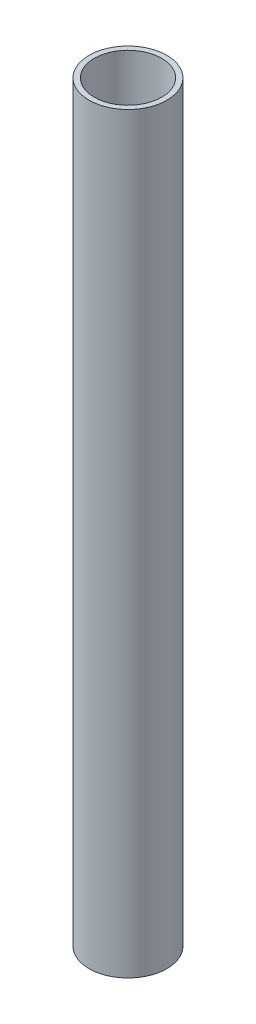
ISO-10303-21;
HEADER;
FILE_DESCRIPTION(('STEP AP214'),'2;1');
FILE_NAME('part.step','',(''),(''),'','','');
FILE_SCHEMA(('AUTOMOTIVE_DESIGN { 1 0 10303 214 1 1 1 1 }'));
ENDSEC;
DATA;
#1=APPLICATION_CONTEXT('core data for automotive mechanical design processes');
#2=APPLICATION_PROTOCOL_DEFINITION('international standard','automotive_design',2000,#1);
#3=PRODUCT_CONTEXT('',#1,'mechanical');
#4=PRODUCT('Part','Part','',(#3));
#5=PRODUCT_RELATED_PRODUCT_CATEGORY('part','',(#4));
#6=PRODUCT_DEFINITION_FORMATION('','',#4);
#7=PRODUCT_DEFINITION_CONTEXT('part definition',#1,'design');
#8=PRODUCT_DEFINITION('design','',#6,#7);
#9=PRODUCT_DEFINITION_SHAPE('','',#8);
#10=(LENGTH_UNIT() NAMED_UNIT(*) SI_UNIT(.MILLI.,.METRE.));
#11=(NAMED_UNIT(*) PLANE_ANGLE_UNIT() SI_UNIT($,.RADIAN.));
#12=(NAMED_UNIT(*) SI_UNIT($,.STERADIAN.) SOLID_ANGLE_UNIT());
#13=UNCERTAINTY_MEASURE_WITH_UNIT(LENGTH_MEASURE(1.E-05),#10,'distance_accuracy_value','');
#14=(GEOMETRIC_REPRESENTATION_CONTEXT(3) GLOBAL_UNCERTAINTY_ASSIGNED_CONTEXT((#13)) GLOBAL_UNIT_ASSIGNED_CONTEXT((#10,
#11,#12)) REPRESENTATION_CONTEXT('',''));
#15=CARTESIAN_POINT('',(0.,0.,0.));
#16=DIRECTION('',(0.,0.,1.));
#17=DIRECTION('',(1.,0.,0.));
#18=AXIS2_PLACEMENT_3D('',#15,#16,#17);
#19=CARTESIAN_POINT('',(0.,145.,0.));
#20=DIRECTION('',(0.,1.,0.));
#21=DIRECTION('',(0.,0.,1.));
#22=AXIS2_PLACEMENT_3D('',#19,#20,#21);
#23=PLANE('',#22);
#24=CARTESIAN_POINT('',(0.,145.,0.));
#25=DIRECTION('',(0.,1.,0.));
#26=DIRECTION('',(0.,0.,1.));
#27=AXIS2_PLACEMENT_3D('',#24,#25,#26);
#28=CIRCLE('',#27,7.5);
#29=CARTESIAN_POINT('',(0.,145.,7.5));
#30=VERTEX_POINT('',#29);
#31=EDGE_CURVE('E10',#30,#30,#28,.T.);
#32=ORIENTED_EDGE('',*,*,#31,.T.);
#33=EDGE_LOOP('',(#32));
#34=FACE_BOUND('',#33,.T.);
#35=CARTESIAN_POINT('',(0.,145.,0.));
#36=DIRECTION('',(0.,1.,0.));
#37=DIRECTION('',(0.,0.,1.));
#38=AXIS2_PLACEMENT_3D('',#35,#36,#37);
#39=CIRCLE('',#38,6.5);
#40=CARTESIAN_POINT('',(0.,145.,6.5));
#41=VERTEX_POINT('',#40);
#42=EDGE_CURVE('E45',#41,#41,#39,.T.);
#43=ORIENTED_EDGE('',*,*,#42,.F.);
#44=EDGE_LOOP('',(#43));
#45=FACE_BOUND('',#44,.T.);
#46=ADVANCED_FACE('F34',(#34,#45),#23,.T.);
#47=CARTESIAN_POINT('',(0.,0.,0.));
#48=DIRECTION('',(0.,1.,0.));
#49=DIRECTION('',(0.,0.,1.));
#50=AXIS2_PLACEMENT_3D('',#47,#48,#49);
#51=PLANE('',#50);
#52=CARTESIAN_POINT('',(0.,0.,0.));
#53=DIRECTION('',(0.,1.,0.));
#54=DIRECTION('',(0.,0.,1.));
#55=AXIS2_PLACEMENT_3D('',#52,#53,#54);
#56=CIRCLE('',#55,7.5);
#57=CARTESIAN_POINT('',(0.,0.,7.5));
#58=VERTEX_POINT('',#57);
#59=EDGE_CURVE('E38',#58,#58,#56,.T.);
#60=ORIENTED_EDGE('',*,*,#59,.F.);
#61=EDGE_LOOP('',(#60));
#62=FACE_BOUND('',#61,.T.);
#63=CARTESIAN_POINT('',(0.,0.,0.));
#64=DIRECTION('',(0.,1.,0.));
#65=DIRECTION('',(0.,0.,1.));
#66=AXIS2_PLACEMENT_3D('',#63,#64,#65);
#67=CIRCLE('',#66,6.5);
#68=CARTESIAN_POINT('',(0.,0.,6.5));
#69=VERTEX_POINT('',#68);
#70=EDGE_CURVE('E47',#69,#69,#67,.T.);
#71=ORIENTED_EDGE('',*,*,#70,.T.);
#72=EDGE_LOOP('',(#71));
#73=FACE_BOUND('',#72,.T.);
#74=ADVANCED_FACE('F57',(#62,#73),#51,.F.);
#75=CARTESIAN_POINT('',(0.,145.,0.));
#76=DIRECTION('',(0.,-1.,0.));
#77=DIRECTION('',(0.,0.,-1.));
#78=AXIS2_PLACEMENT_3D('',#75,#76,#77);
#79=CYLINDRICAL_SURFACE('',#78,7.5);
#80=ORIENTED_EDGE('',*,*,#31,.F.);
#81=EDGE_LOOP('',(#80));
#82=FACE_BOUND('',#81,.T.);
#83=ORIENTED_EDGE('',*,*,#59,.T.);
#84=EDGE_LOOP('',(#83));
#85=FACE_BOUND('',#84,.T.);
#86=ADVANCED_FACE('F36',(#82,#85),#79,.T.);
#87=CARTESIAN_POINT('',(0.,145.,0.));
#88=DIRECTION('',(0.,-1.,0.));
#89=DIRECTION('',(0.,0.,-1.));
#90=AXIS2_PLACEMENT_3D('',#87,#88,#89);
#91=CYLINDRICAL_SURFACE('',#90,6.5);
#92=ORIENTED_EDGE('',*,*,#42,.T.);
#93=EDGE_LOOP('',(#92));
#94=FACE_BOUND('',#93,.T.);
#95=ORIENTED_EDGE('',*,*,#70,.F.);
#96=EDGE_LOOP('',(#95));
#97=FACE_BOUND('',#96,.T.);
#98=ADVANCED_FACE('F53',(#94,#97),#91,.F.);
#99=CLOSED_SHELL('',(#46,#74,#86,#98));
#100=MANIFOLD_SOLID_BREP('B2',#99);
#101=ADVANCED_BREP_SHAPE_REPRESENTATION('',(#18,#100),#14);
#102=SHAPE_DEFINITION_REPRESENTATION(#9,#101);
ENDSEC;
END-ISO-10303-21;
